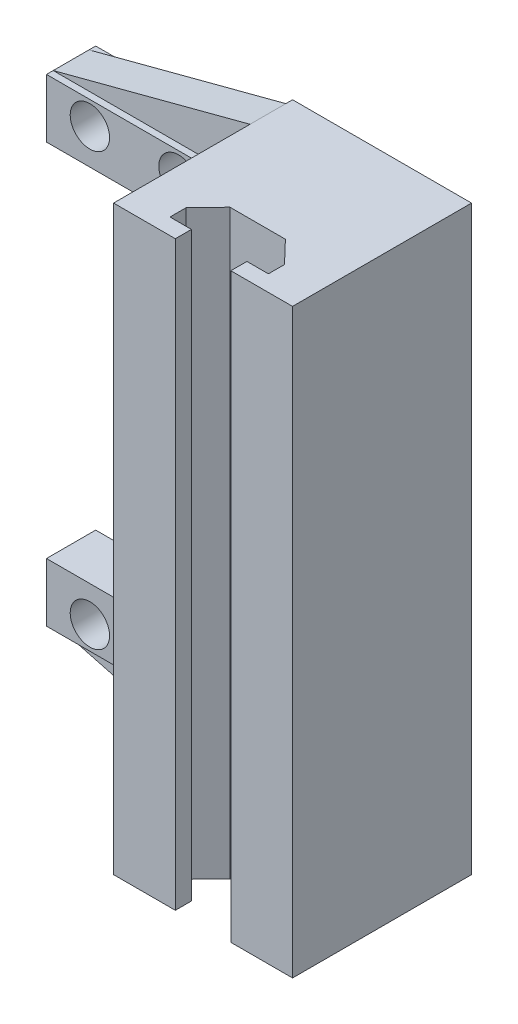
ISO-10303-21;
HEADER;
FILE_DESCRIPTION(('STEP AP214'),'2;1');
FILE_NAME('part.step','',(''),(''),'','','');
FILE_SCHEMA(('AUTOMOTIVE_DESIGN { 1 0 10303 214 1 1 1 1 }'));
ENDSEC;
DATA;
#1=APPLICATION_CONTEXT('core data for automotive mechanical design processes');
#2=APPLICATION_PROTOCOL_DEFINITION('international standard','automotive_design',2000,#1);
#3=PRODUCT_CONTEXT('',#1,'mechanical');
#4=PRODUCT('Part','Part','',(#3));
#5=PRODUCT_RELATED_PRODUCT_CATEGORY('part','',(#4));
#6=PRODUCT_DEFINITION_FORMATION('','',#4);
#7=PRODUCT_DEFINITION_CONTEXT('part definition',#1,'design');
#8=PRODUCT_DEFINITION('design','',#6,#7);
#9=PRODUCT_DEFINITION_SHAPE('','',#8);
#10=(LENGTH_UNIT() NAMED_UNIT(*) SI_UNIT(.MILLI.,.METRE.));
#11=(NAMED_UNIT(*) PLANE_ANGLE_UNIT() SI_UNIT($,.RADIAN.));
#12=(NAMED_UNIT(*) SI_UNIT($,.STERADIAN.) SOLID_ANGLE_UNIT());
#13=UNCERTAINTY_MEASURE_WITH_UNIT(LENGTH_MEASURE(1.E-05),#10,'distance_accuracy_value','');
#14=(GEOMETRIC_REPRESENTATION_CONTEXT(3) GLOBAL_UNCERTAINTY_ASSIGNED_CONTEXT((#13)) GLOBAL_UNIT_ASSIGNED_CONTEXT((#10,
#11,#12)) REPRESENTATION_CONTEXT('',''));
#15=CARTESIAN_POINT('',(0.,0.,0.));
#16=DIRECTION('',(0.,0.,1.));
#17=DIRECTION('',(1.,0.,0.));
#18=AXIS2_PLACEMENT_3D('',#15,#16,#17);
#19=CARTESIAN_POINT('',(-37.1897322756986,65.,21.1385668960311));
#20=DIRECTION('',(1.,0.,0.));
#21=DIRECTION('',(0.,0.,-1.));
#22=AXIS2_PLACEMENT_3D('',#19,#20,#21);
#23=PLANE('',#22);
#24=DIRECTION('',(0.,0.,1.));
#25=VECTOR('',#24,1.);
#26=CARTESIAN_POINT('',(-37.1897322756986,0.,21.1385668960311));
#27=LINE('',#26,#25);
#28=CARTESIAN_POINT('',(-37.1897322756986,0.,21.1385668960311));
#29=VERTEX_POINT('',#28);
#30=CARTESIAN_POINT('',(-37.1897322756986,0.,21.8885668960311));
#31=VERTEX_POINT('',#30);
#32=EDGE_CURVE('E276',#29,#31,#27,.T.);
#33=ORIENTED_EDGE('',*,*,#32,.T.);
#34=DIRECTION('',(0.,1.,0.));
#35=VECTOR('',#34,1.);
#36=CARTESIAN_POINT('',(-37.1897322756986,65.,21.8885668960311));
#37=LINE('',#36,#35);
#38=CARTESIAN_POINT('',(-37.1897322756986,5.8,21.8885668960311));
#39=VERTEX_POINT('',#38);
#40=EDGE_CURVE('E593',#31,#39,#37,.T.);
#41=ORIENTED_EDGE('',*,*,#40,.T.);
#42=DIRECTION('',(0.,0.,-1.));
#43=VECTOR('',#42,1.);
#44=CARTESIAN_POINT('',(-37.1897322756986,5.8,0.));
#45=LINE('',#44,#43);
#46=CARTESIAN_POINT('',(-37.1897322756986,5.8,21.1385668960311));
#47=VERTEX_POINT('',#46);
#48=EDGE_CURVE('E381',#39,#47,#45,.T.);
#49=ORIENTED_EDGE('',*,*,#48,.T.);
#50=DIRECTION('',(0.,-1.,0.));
#51=VECTOR('',#50,1.);
#52=CARTESIAN_POINT('',(-37.1897322756986,65.,21.1385668960311));
#53=LINE('',#52,#51);
#54=EDGE_CURVE('E61',#47,#29,#53,.T.);
#55=ORIENTED_EDGE('',*,*,#54,.T.);
#56=EDGE_LOOP('',(#33,#41,#49,#55));
#57=FACE_BOUND('',#56,.T.);
#58=ADVANCED_FACE('F49',(#57),#23,.F.);
#59=CARTESIAN_POINT('',(-57.1897322756986,5.8,0.));
#60=DIRECTION('',(0.,-1.,0.));
#61=DIRECTION('',(0.,0.,-1.));
#62=AXIS2_PLACEMENT_3D('',#59,#60,#61);
#63=PLANE('',#62);
#64=DIRECTION('',(0.,0.,1.));
#65=VECTOR('',#64,1.);
#66=CARTESIAN_POINT('',(-59.1897322756986,5.8,21.1385668960311));
#67=LINE('',#66,#65);
#68=CARTESIAN_POINT('',(-59.1897322756986,5.8,25.8885668960311));
#69=VERTEX_POINT('',#68);
#70=CARTESIAN_POINT('',(-59.1897322756986,5.8,26.6385668960311));
#71=VERTEX_POINT('',#70);
#72=EDGE_CURVE('E525',#69,#71,#67,.T.);
#73=ORIENTED_EDGE('',*,*,#72,.F.);
#74=DIRECTION('',(1.,0.,0.));
#75=VECTOR('',#74,1.);
#76=CARTESIAN_POINT('',(-57.1897322756986,5.8,25.8885668960311));
#77=LINE('',#76,#75);
#78=CARTESIAN_POINT('',(-37.1897322756986,5.8,25.8885668960311));
#79=VERTEX_POINT('',#78);
#80=EDGE_CURVE('E255',#69,#79,#77,.T.);
#81=ORIENTED_EDGE('',*,*,#80,.T.);
#82=CARTESIAN_POINT('',(-37.1897322756986,5.8,26.6385668960311));
#83=VERTEX_POINT('',#82);
#84=EDGE_CURVE('E267',#83,#79,#45,.T.);
#85=ORIENTED_EDGE('',*,*,#84,.F.);
#86=DIRECTION('',(1.,0.,0.));
#87=VECTOR('',#86,1.);
#88=CARTESIAN_POINT('',(-57.1897322756986,5.8,26.6385668960311));
#89=LINE('',#88,#87);
#90=EDGE_CURVE('E384',#71,#83,#89,.T.);
#91=ORIENTED_EDGE('',*,*,#90,.F.);
#92=EDGE_LOOP('',(#73,#81,#85,#91));
#93=FACE_BOUND('',#92,.T.);
#94=ADVANCED_FACE('F608',(#93),#63,.T.);
#95=CARTESIAN_POINT('',(-37.1897322756986,52.65,21.1385668960311));
#96=VERTEX_POINT('',#95);
#97=CARTESIAN_POINT('',(-37.1897322756986,12.35,21.1385668960311));
#98=VERTEX_POINT('',#97);
#99=EDGE_CURVE('E59',#96,#98,#53,.T.);
#100=ORIENTED_EDGE('',*,*,#99,.T.);
#101=DIRECTION('',(0.,0.,-1.));
#102=VECTOR('',#101,1.);
#103=CARTESIAN_POINT('',(-37.1897322756986,12.35,0.));
#104=LINE('',#103,#102);
#105=CARTESIAN_POINT('',(-37.1897322756986,12.35,26.6385668960311));
#106=VERTEX_POINT('',#105);
#107=EDGE_CURVE('E378',#106,#98,#104,.T.);
#108=ORIENTED_EDGE('',*,*,#107,.F.);
#109=DIRECTION('',(0.,1.,0.));
#110=VECTOR('',#109,1.);
#111=CARTESIAN_POINT('',(-37.1897322756986,0.,26.6385668960311));
#112=LINE('',#111,#110);
#113=EDGE_CURVE('E374',#83,#106,#112,.T.);
#114=ORIENTED_EDGE('',*,*,#113,.F.);
#115=ORIENTED_EDGE('',*,*,#84,.T.);
#116=DIRECTION('',(0.,1.,0.));
#117=VECTOR('',#116,1.);
#118=CARTESIAN_POINT('',(-37.1897322756986,65.,25.8885668960311));
#119=LINE('',#118,#117);
#120=CARTESIAN_POINT('',(-37.1897322756986,0.,25.8885668960311));
#121=VERTEX_POINT('',#120);
#122=EDGE_CURVE('E253',#121,#79,#119,.T.);
#123=ORIENTED_EDGE('',*,*,#122,.F.);
#124=CARTESIAN_POINT('',(-37.1897322756986,0.,41.1385668960311));
#125=VERTEX_POINT('',#124);
#126=EDGE_CURVE('E264',#121,#125,#27,.T.);
#127=ORIENTED_EDGE('',*,*,#126,.T.);
#128=DIRECTION('',(0.,-1.,0.));
#129=VECTOR('',#128,1.);
#130=CARTESIAN_POINT('',(-37.1897322756986,65.,41.1385668960311));
#131=LINE('',#130,#129);
#132=CARTESIAN_POINT('',(-37.1897322756986,65.,41.1385668960311));
#133=VERTEX_POINT('',#132);
#134=EDGE_CURVE('E285',#133,#125,#131,.T.);
#135=ORIENTED_EDGE('',*,*,#134,.F.);
#136=DIRECTION('',(0.,0.,1.));
#137=VECTOR('',#136,1.);
#138=CARTESIAN_POINT('',(-37.1897322756986,65.,21.1385668960311));
#139=LINE('',#138,#137);
#140=CARTESIAN_POINT('',(-37.1897322756986,65.,25.8885668960311));
#141=VERTEX_POINT('',#140);
#142=EDGE_CURVE('E446',#141,#133,#139,.T.);
#143=ORIENTED_EDGE('',*,*,#142,.F.);
#144=DIRECTION('',(0.,1.,0.));
#145=VECTOR('',#144,1.);
#146=CARTESIAN_POINT('',(-37.1897322756986,65.,25.8885668960311));
#147=LINE('',#146,#145);
#148=CARTESIAN_POINT('',(-37.1897322756986,59.2,25.8885668960311));
#149=VERTEX_POINT('',#148);
#150=EDGE_CURVE('E502',#149,#141,#147,.T.);
#151=ORIENTED_EDGE('',*,*,#150,.F.);
#152=DIRECTION('',(0.,0.,-1.));
#153=VECTOR('',#152,1.);
#154=CARTESIAN_POINT('',(-37.1897322756986,59.2,26.6385668960311));
#155=LINE('',#154,#153);
#156=CARTESIAN_POINT('',(-37.1897322756986,59.2,26.6385668960311));
#157=VERTEX_POINT('',#156);
#158=EDGE_CURVE('E367',#157,#149,#155,.T.);
#159=ORIENTED_EDGE('',*,*,#158,.F.);
#160=DIRECTION('',(0.,-1.,0.));
#161=VECTOR('',#160,1.);
#162=CARTESIAN_POINT('',(-37.1897322756986,59.2,26.6385668960311));
#163=LINE('',#162,#161);
#164=CARTESIAN_POINT('',(-37.1897322756986,52.65,26.6385668960311));
#165=VERTEX_POINT('',#164);
#166=EDGE_CURVE('E362',#157,#165,#163,.T.);
#167=ORIENTED_EDGE('',*,*,#166,.T.);
#168=DIRECTION('',(0.,0.,-1.));
#169=VECTOR('',#168,1.);
#170=CARTESIAN_POINT('',(-37.1897322756986,52.65,26.6385668960311));
#171=LINE('',#170,#169);
#172=EDGE_CURVE('E371',#165,#96,#171,.T.);
#173=ORIENTED_EDGE('',*,*,#172,.T.);
#174=EDGE_LOOP('',(#100,#108,#114,#115,#123,#127,#135,#143,#151,#159,#167,#173));
#175=FACE_BOUND('',#174,.T.);
#176=ADVANCED_FACE('F262',(#175),#23,.F.);
#177=CARTESIAN_POINT('',(-57.1897322756986,59.2,26.6385668960311));
#178=DIRECTION('',(0.,-1.,0.));
#179=DIRECTION('',(0.,0.,-1.));
#180=AXIS2_PLACEMENT_3D('',#177,#178,#179);
#181=PLANE('',#180);
#182=DIRECTION('',(1.,0.,0.));
#183=VECTOR('',#182,1.);
#184=CARTESIAN_POINT('',(-57.1897322756986,59.2,25.8885668960311));
#185=LINE('',#184,#183);
#186=CARTESIAN_POINT('',(-59.1897322756986,59.2,25.8885668960311));
#187=VERTEX_POINT('',#186);
#188=EDGE_CURVE('E620',#187,#149,#185,.T.);
#189=ORIENTED_EDGE('',*,*,#188,.F.);
#190=DIRECTION('',(0.,0.,-1.));
#191=VECTOR('',#190,1.);
#192=CARTESIAN_POINT('',(-59.1897322756986,59.2,21.1385668960311));
#193=LINE('',#192,#191);
#194=CARTESIAN_POINT('',(-59.1897322756986,59.2,26.6385668960311));
#195=VERTEX_POINT('',#194);
#196=EDGE_CURVE('E547',#195,#187,#193,.T.);
#197=ORIENTED_EDGE('',*,*,#196,.F.);
#198=DIRECTION('',(1.,0.,0.));
#199=VECTOR('',#198,1.);
#200=CARTESIAN_POINT('',(-57.1897322756986,59.2,26.6385668960311));
#201=LINE('',#200,#199);
#202=EDGE_CURVE('E349',#195,#157,#201,.T.);
#203=ORIENTED_EDGE('',*,*,#202,.T.);
#204=ORIENTED_EDGE('',*,*,#158,.T.);
#205=EDGE_LOOP('',(#189,#197,#203,#204));
#206=FACE_BOUND('',#205,.T.);
#207=ADVANCED_FACE('F633',(#206),#181,.F.);
#208=CARTESIAN_POINT('',(-37.1897322756986,65.,21.1385668960311));
#209=DIRECTION('',(0.,0.,-1.));
#210=DIRECTION('',(-1.,0.,0.));
#211=AXIS2_PLACEMENT_3D('',#208,#209,#210);
#212=PLANE('',#211);
#213=CARTESIAN_POINT('',(-44.4397322756986,56.6,21.1385668960311));
#214=DIRECTION('',(0.,0.,-1.));
#215=DIRECTION('',(-1.,0.,0.));
#216=AXIS2_PLACEMENT_3D('',#213,#214,#215);
#217=CIRCLE('',#216,2.2);
#218=CARTESIAN_POINT('',(-46.6397322756986,56.6,21.1385668960311));
#219=VERTEX_POINT('',#218);
#220=EDGE_CURVE('E557',#219,#219,#217,.T.);
#221=ORIENTED_EDGE('',*,*,#220,.F.);
#222=EDGE_LOOP('',(#221));
#223=FACE_BOUND('',#222,.T.);
#224=CARTESIAN_POINT('',(-54.3397322756986,8.4,21.1385668960311));
#225=DIRECTION('',(0.,0.,-1.));
#226=DIRECTION('',(-1.,0.,0.));
#227=AXIS2_PLACEMENT_3D('',#224,#225,#226);
#228=CIRCLE('',#227,2.2);
#229=CARTESIAN_POINT('',(-56.5397322756986,8.4,21.1385668960311));
#230=VERTEX_POINT('',#229);
#231=EDGE_CURVE('E556',#230,#230,#228,.T.);
#232=ORIENTED_EDGE('',*,*,#231,.F.);
#233=EDGE_LOOP('',(#232));
#234=FACE_BOUND('',#233,.T.);
#235=CARTESIAN_POINT('',(-44.4397322756986,8.4,21.1385668960311));
#236=DIRECTION('',(0.,0.,-1.));
#237=DIRECTION('',(-1.,0.,0.));
#238=AXIS2_PLACEMENT_3D('',#235,#236,#237);
#239=CIRCLE('',#238,2.2);
#240=CARTESIAN_POINT('',(-46.6397322756986,8.4,21.1385668960311));
#241=VERTEX_POINT('',#240);
#242=EDGE_CURVE('E551',#241,#241,#239,.T.);
#243=ORIENTED_EDGE('',*,*,#242,.F.);
#244=EDGE_LOOP('',(#243));
#245=FACE_BOUND('',#244,.T.);
#246=CARTESIAN_POINT('',(-54.3397322756986,56.6,21.1385668960311));
#247=DIRECTION('',(0.,0.,-1.));
#248=DIRECTION('',(-1.,0.,0.));
#249=AXIS2_PLACEMENT_3D('',#246,#247,#248);
#250=CIRCLE('',#249,2.2);
#251=CARTESIAN_POINT('',(-56.5397322756986,56.6,21.1385668960311));
#252=VERTEX_POINT('',#251);
#253=EDGE_CURVE('E334',#252,#252,#250,.T.);
#254=ORIENTED_EDGE('',*,*,#253,.F.);
#255=EDGE_LOOP('',(#254));
#256=FACE_BOUND('',#255,.T.);
#257=DIRECTION('',(1.,0.,0.));
#258=VECTOR('',#257,1.);
#259=CARTESIAN_POINT('',(-37.1897322756986,0.,21.1385668960311));
#260=LINE('',#259,#258);
#261=CARTESIAN_POINT('',(-17.1897322756986,0.,21.1385668960311));
#262=VERTEX_POINT('',#261);
#263=EDGE_CURVE('E400',#29,#262,#260,.T.);
#264=ORIENTED_EDGE('',*,*,#263,.F.);
#265=ORIENTED_EDGE('',*,*,#54,.F.);
#266=DIRECTION('',(1.,0.,0.));
#267=VECTOR('',#266,1.);
#268=CARTESIAN_POINT('',(-57.1897322756986,5.8,21.1385668960311));
#269=LINE('',#268,#267);
#270=CARTESIAN_POINT('',(-59.1897322756986,5.8,21.1385668960311));
#271=VERTEX_POINT('',#270);
#272=EDGE_CURVE('E388',#271,#47,#269,.T.);
#273=ORIENTED_EDGE('',*,*,#272,.F.);
#274=DIRECTION('',(0.,-1.,0.));
#275=VECTOR('',#274,1.);
#276=CARTESIAN_POINT('',(-59.1897322756986,5.8,21.1385668960311));
#277=LINE('',#276,#275);
#278=CARTESIAN_POINT('',(-59.1897322756986,12.35,21.1385668960311));
#279=VERTEX_POINT('',#278);
#280=EDGE_CURVE('E530',#279,#271,#277,.T.);
#281=ORIENTED_EDGE('',*,*,#280,.F.);
#282=DIRECTION('',(1.,0.,0.));
#283=VECTOR('',#282,1.);
#284=CARTESIAN_POINT('',(-57.1897322756986,12.35,21.1385668960311));
#285=LINE('',#284,#283);
#286=EDGE_CURVE('E392',#279,#98,#285,.T.);
#287=ORIENTED_EDGE('',*,*,#286,.T.);
#288=ORIENTED_EDGE('',*,*,#99,.F.);
#289=DIRECTION('',(1.,0.,0.));
#290=VECTOR('',#289,1.);
#291=CARTESIAN_POINT('',(-57.1897322756986,52.65,21.1385668960311));
#292=LINE('',#291,#290);
#293=CARTESIAN_POINT('',(-59.1897322756986,52.65,21.1385668960311));
#294=VERTEX_POINT('',#293);
#295=EDGE_CURVE('E366',#294,#96,#292,.T.);
#296=ORIENTED_EDGE('',*,*,#295,.F.);
#297=DIRECTION('',(0.,-1.,0.));
#298=VECTOR('',#297,1.);
#299=CARTESIAN_POINT('',(-59.1897322756986,59.2,21.1385668960311));
#300=LINE('',#299,#298);
#301=CARTESIAN_POINT('',(-59.1897322756986,59.2,21.1385668960311));
#302=VERTEX_POINT('',#301);
#303=EDGE_CURVE('E535',#302,#294,#300,.T.);
#304=ORIENTED_EDGE('',*,*,#303,.F.);
#305=DIRECTION('',(1.,0.,0.));
#306=VECTOR('',#305,1.);
#307=CARTESIAN_POINT('',(-57.1897322756986,59.2,21.1385668960311));
#308=LINE('',#307,#306);
#309=CARTESIAN_POINT('',(-37.1897322756986,59.2,21.1385668960311));
#310=VERTEX_POINT('',#309);
#311=EDGE_CURVE('E358',#302,#310,#308,.T.);
#312=ORIENTED_EDGE('',*,*,#311,.T.);
#313=CARTESIAN_POINT('',(-37.1897322756986,65.,21.1385668960311));
#314=VERTEX_POINT('',#313);
#315=EDGE_CURVE('E11',#314,#310,#53,.T.);
#316=ORIENTED_EDGE('',*,*,#315,.F.);
#317=DIRECTION('',(1.,0.,0.));
#318=VECTOR('',#317,1.);
#319=CARTESIAN_POINT('',(-37.1897322756986,65.,21.1385668960311));
#320=LINE('',#319,#318);
#321=CARTESIAN_POINT('',(-17.1897322756986,65.,21.1385668960311));
#322=VERTEX_POINT('',#321);
#323=EDGE_CURVE('E280',#314,#322,#320,.T.);
#324=ORIENTED_EDGE('',*,*,#323,.T.);
#325=DIRECTION('',(0.,-1.,0.));
#326=VECTOR('',#325,1.);
#327=CARTESIAN_POINT('',(-17.1897322756986,65.,21.1385668960311));
#328=LINE('',#327,#326);
#329=EDGE_CURVE('E325',#322,#262,#328,.T.);
#330=ORIENTED_EDGE('',*,*,#329,.T.);
#331=EDGE_LOOP('',(#264,#265,#273,#281,#287,#288,#296,#304,#312,#316,#324,#330));
#332=FACE_BOUND('',#331,.T.);
#333=ADVANCED_FACE('F51',(#223,#234,#245,#256,#332),#212,.T.);
#334=CARTESIAN_POINT('',(-37.1897322756986,59.2,21.8885668960311));
#335=VERTEX_POINT('',#334);
#336=EDGE_CURVE('E365',#335,#310,#155,.T.);
#337=ORIENTED_EDGE('',*,*,#336,.F.);
#338=DIRECTION('',(0.,1.,0.));
#339=VECTOR('',#338,1.);
#340=CARTESIAN_POINT('',(-37.1897322756986,65.,21.8885668960311));
#341=LINE('',#340,#339);
#342=CARTESIAN_POINT('',(-37.1897322756986,65.,21.8885668960311));
#343=VERTEX_POINT('',#342);
#344=EDGE_CURVE('E518',#335,#343,#341,.T.);
#345=ORIENTED_EDGE('',*,*,#344,.T.);
#346=EDGE_CURVE('E328',#314,#343,#139,.T.);
#347=ORIENTED_EDGE('',*,*,#346,.F.);
#348=ORIENTED_EDGE('',*,*,#315,.T.);
#349=EDGE_LOOP('',(#337,#345,#347,#348));
#350=FACE_BOUND('',#349,.T.);
#351=ADVANCED_FACE('F583',(#350),#23,.F.);
#352=CARTESIAN_POINT('',(-37.1897322756986,65.,41.1385668960311));
#353=DIRECTION('',(0.,0.,-1.));
#354=DIRECTION('',(-1.,0.,0.));
#355=AXIS2_PLACEMENT_3D('',#352,#353,#354);
#356=PLANE('',#355);
#357=DIRECTION('',(1.,0.,0.));
#358=VECTOR('',#357,1.);
#359=CARTESIAN_POINT('',(-37.1897322756986,0.,41.1385668960311));
#360=LINE('',#359,#358);
#361=CARTESIAN_POINT('',(-30.2897322756986,0.,41.1385668960311));
#362=VERTEX_POINT('',#361);
#363=EDGE_CURVE('E274',#125,#362,#360,.T.);
#364=ORIENTED_EDGE('',*,*,#363,.T.);
#365=DIRECTION('',(0.,-1.,0.));
#366=VECTOR('',#365,1.);
#367=CARTESIAN_POINT('',(-30.2897322756986,65.,41.1385668960311));
#368=LINE('',#367,#366);
#369=CARTESIAN_POINT('',(-30.2897322756986,65.,41.1385668960311));
#370=VERTEX_POINT('',#369);
#371=EDGE_CURVE('E288',#370,#362,#368,.T.);
#372=ORIENTED_EDGE('',*,*,#371,.F.);
#373=DIRECTION('',(1.,0.,0.));
#374=VECTOR('',#373,1.);
#375=CARTESIAN_POINT('',(-37.1897322756986,65.,41.1385668960311));
#376=LINE('',#375,#374);
#377=EDGE_CURVE('E443',#133,#370,#376,.T.);
#378=ORIENTED_EDGE('',*,*,#377,.F.);
#379=ORIENTED_EDGE('',*,*,#134,.T.);
#380=EDGE_LOOP('',(#364,#372,#378,#379));
#381=FACE_BOUND('',#380,.T.);
#382=ADVANCED_FACE('F498',(#381),#356,.F.);
#383=CARTESIAN_POINT('',(-30.2897322756986,65.,39.3385668960311));
#384=DIRECTION('',(1.,0.,0.));
#385=DIRECTION('',(0.,0.,-1.));
#386=AXIS2_PLACEMENT_3D('',#383,#384,#385);
#387=PLANE('',#386);
#388=DIRECTION('',(0.,0.,1.));
#389=VECTOR('',#388,1.);
#390=CARTESIAN_POINT('',(-30.2897322756986,0.,39.3385668960311));
#391=LINE('',#390,#389);
#392=CARTESIAN_POINT('',(-30.2897322756986,0.,39.3385668960311));
#393=VERTEX_POINT('',#392);
#394=EDGE_CURVE('E281',#393,#362,#391,.T.);
#395=ORIENTED_EDGE('',*,*,#394,.F.);
#396=DIRECTION('',(0.,-1.,0.));
#397=VECTOR('',#396,1.);
#398=CARTESIAN_POINT('',(-30.2897322756986,65.,39.3385668960311));
#399=LINE('',#398,#397);
#400=CARTESIAN_POINT('',(-30.2897322756986,65.,39.3385668960311));
#401=VERTEX_POINT('',#400);
#402=EDGE_CURVE('E291',#401,#393,#399,.T.);
#403=ORIENTED_EDGE('',*,*,#402,.F.);
#404=DIRECTION('',(0.,0.,1.));
#405=VECTOR('',#404,1.);
#406=CARTESIAN_POINT('',(-30.2897322756986,65.,39.3385668960311));
#407=LINE('',#406,#405);
#408=EDGE_CURVE('E439',#401,#370,#407,.T.);
#409=ORIENTED_EDGE('',*,*,#408,.T.);
#410=ORIENTED_EDGE('',*,*,#371,.T.);
#411=EDGE_LOOP('',(#395,#403,#409,#410));
#412=FACE_BOUND('',#411,.T.);
#413=ADVANCED_FACE('F493',(#412),#387,.T.);
#414=CARTESIAN_POINT('',(-32.6897322756986,65.,39.3385668960311));
#415=DIRECTION('',(0.,0.,-1.));
#416=DIRECTION('',(-1.,0.,0.));
#417=AXIS2_PLACEMENT_3D('',#414,#415,#416);
#418=PLANE('',#417);
#419=DIRECTION('',(1.,0.,0.));
#420=VECTOR('',#419,1.);
#421=CARTESIAN_POINT('',(-32.6897322756986,0.,39.3385668960311));
#422=LINE('',#421,#420);
#423=CARTESIAN_POINT('',(-32.6897322756986,0.,39.3385668960311));
#424=VERTEX_POINT('',#423);
#425=EDGE_CURVE('E485',#424,#393,#422,.T.);
#426=ORIENTED_EDGE('',*,*,#425,.F.);
#427=DIRECTION('',(0.,-1.,0.));
#428=VECTOR('',#427,1.);
#429=CARTESIAN_POINT('',(-32.6897322756986,65.,39.3385668960311));
#430=LINE('',#429,#428);
#431=CARTESIAN_POINT('',(-32.6897322756986,65.,39.3385668960311));
#432=VERTEX_POINT('',#431);
#433=EDGE_CURVE('E294',#432,#424,#430,.T.);
#434=ORIENTED_EDGE('',*,*,#433,.F.);
#435=DIRECTION('',(1.,0.,0.));
#436=VECTOR('',#435,1.);
#437=CARTESIAN_POINT('',(-32.6897322756986,65.,39.3385668960311));
#438=LINE('',#437,#436);
#439=EDGE_CURVE('E435',#432,#401,#438,.T.);
#440=ORIENTED_EDGE('',*,*,#439,.T.);
#441=ORIENTED_EDGE('',*,*,#402,.T.);
#442=EDGE_LOOP('',(#426,#434,#440,#441));
#443=FACE_BOUND('',#442,.T.);
#444=ADVANCED_FACE('F1008',(#443),#418,.T.);
#445=CARTESIAN_POINT('',(-32.6897322756986,65.,39.3385668960311));
#446=DIRECTION('',(-1.,0.,0.));
#447=DIRECTION('',(0.,0.,1.));
#448=AXIS2_PLACEMENT_3D('',#445,#446,#447);
#449=PLANE('',#448);
#450=DIRECTION('',(0.,0.,-1.));
#451=VECTOR('',#450,1.);
#452=CARTESIAN_POINT('',(-32.6897322756986,0.,39.3385668960311));
#453=LINE('',#452,#451);
#454=CARTESIAN_POINT('',(-32.6897322756986,0.,37.5385668960311));
#455=VERTEX_POINT('',#454);
#456=EDGE_CURVE('E482',#424,#455,#453,.T.);
#457=ORIENTED_EDGE('',*,*,#456,.T.);
#458=DIRECTION('',(0.,-1.,0.));
#459=VECTOR('',#458,1.);
#460=CARTESIAN_POINT('',(-32.6897322756986,65.,37.5385668960311));
#461=LINE('',#460,#459);
#462=CARTESIAN_POINT('',(-32.6897322756986,65.,37.5385668960311));
#463=VERTEX_POINT('',#462);
#464=EDGE_CURVE('E297',#463,#455,#461,.T.);
#465=ORIENTED_EDGE('',*,*,#464,.F.);
#466=DIRECTION('',(0.,0.,-1.));
#467=VECTOR('',#466,1.);
#468=CARTESIAN_POINT('',(-32.6897322756986,65.,39.3385668960311));
#469=LINE('',#468,#467);
#470=EDGE_CURVE('E432',#432,#463,#469,.T.);
#471=ORIENTED_EDGE('',*,*,#470,.F.);
#472=ORIENTED_EDGE('',*,*,#433,.T.);
#473=EDGE_LOOP('',(#457,#465,#471,#472));
#474=FACE_BOUND('',#473,.T.);
#475=ADVANCED_FACE('F998',(#474),#449,.F.);
#476=CARTESIAN_POINT('',(-32.6897322756986,65.,37.5385668960311));
#477=DIRECTION('',(-0.721387321030951,0.,-0.692531828189713));
#478=DIRECTION('',(-0.692531828189713,0.,0.721387321030951));
#479=AXIS2_PLACEMENT_3D('',#476,#477,#478);
#480=PLANE('',#479);
#481=DIRECTION('',(0.692531828189713,0.,-0.721387321030951));
#482=VECTOR('',#481,1.);
#483=CARTESIAN_POINT('',(-32.6897322756986,0.,37.5385668960311));
#484=LINE('',#483,#482);
#485=CARTESIAN_POINT('',(-30.2897322756986,0.,35.0385668960311));
#486=VERTEX_POINT('',#485);
#487=EDGE_CURVE('E479',#455,#486,#484,.T.);
#488=ORIENTED_EDGE('',*,*,#487,.T.);
#489=DIRECTION('',(0.,-1.,0.));
#490=VECTOR('',#489,1.);
#491=CARTESIAN_POINT('',(-30.2897322756986,65.,35.0385668960311));
#492=LINE('',#491,#490);
#493=CARTESIAN_POINT('',(-30.2897322756986,65.,35.0385668960311));
#494=VERTEX_POINT('',#493);
#495=EDGE_CURVE('E301',#494,#486,#492,.T.);
#496=ORIENTED_EDGE('',*,*,#495,.F.);
#497=DIRECTION('',(0.692531828189713,0.,-0.721387321030951));
#498=VECTOR('',#497,1.);
#499=CARTESIAN_POINT('',(-32.6897322756986,65.,37.5385668960311));
#500=LINE('',#499,#498);
#501=EDGE_CURVE('E429',#463,#494,#500,.T.);
#502=ORIENTED_EDGE('',*,*,#501,.F.);
#503=ORIENTED_EDGE('',*,*,#464,.T.);
#504=EDGE_LOOP('',(#488,#496,#502,#503));
#505=FACE_BOUND('',#504,.T.);
#506=ADVANCED_FACE('F988',(#505),#480,.F.);
#507=CARTESIAN_POINT('',(-30.2897322756986,65.,35.0385668960311));
#508=DIRECTION('',(0.,0.,-1.));
#509=DIRECTION('',(-1.,0.,0.));
#510=AXIS2_PLACEMENT_3D('',#507,#508,#509);
#511=PLANE('',#510);
#512=DIRECTION('',(1.,0.,0.));
#513=VECTOR('',#512,1.);
#514=CARTESIAN_POINT('',(-30.2897322756986,0.,35.0385668960311));
#515=LINE('',#514,#513);
#516=CARTESIAN_POINT('',(-24.0897322756986,0.,35.0385668960311));
#517=VERTEX_POINT('',#516);
#518=EDGE_CURVE('E475',#486,#517,#515,.T.);
#519=ORIENTED_EDGE('',*,*,#518,.T.);
#520=DIRECTION('',(0.,-1.,0.));
#521=VECTOR('',#520,1.);
#522=CARTESIAN_POINT('',(-24.0897322756986,65.,35.0385668960311));
#523=LINE('',#522,#521);
#524=CARTESIAN_POINT('',(-24.0897322756986,65.,35.0385668960311));
#525=VERTEX_POINT('',#524);
#526=EDGE_CURVE('E305',#525,#517,#523,.T.);
#527=ORIENTED_EDGE('',*,*,#526,.F.);
#528=DIRECTION('',(1.,0.,0.));
#529=VECTOR('',#528,1.);
#530=CARTESIAN_POINT('',(-30.2897322756986,65.,35.0385668960311));
#531=LINE('',#530,#529);
#532=EDGE_CURVE('E426',#494,#525,#531,.T.);
#533=ORIENTED_EDGE('',*,*,#532,.F.);
#534=ORIENTED_EDGE('',*,*,#495,.T.);
#535=EDGE_LOOP('',(#519,#527,#533,#534));
#536=FACE_BOUND('',#535,.T.);
#537=ADVANCED_FACE('F978',(#536),#511,.F.);
#538=CARTESIAN_POINT('',(-21.6897322756986,65.,37.5385668960311));
#539=DIRECTION('',(-0.72138732103095,0.,0.692531828189715));
#540=DIRECTION('',(0.692531828189715,0.,0.72138732103095));
#541=AXIS2_PLACEMENT_3D('',#538,#539,#540);
#542=PLANE('',#541);
#543=DIRECTION('',(-0.692531828189715,0.,-0.721387321030951));
#544=VECTOR('',#543,1.);
#545=CARTESIAN_POINT('',(-21.6897322756986,0.,37.5385668960311));
#546=LINE('',#545,#544);
#547=CARTESIAN_POINT('',(-21.6897322756986,0.,37.5385668960311));
#548=VERTEX_POINT('',#547);
#549=EDGE_CURVE('E471',#548,#517,#546,.T.);
#550=ORIENTED_EDGE('',*,*,#549,.F.);
#551=DIRECTION('',(0.,-1.,0.));
#552=VECTOR('',#551,1.);
#553=CARTESIAN_POINT('',(-21.6897322756986,65.,37.5385668960311));
#554=LINE('',#553,#552);
#555=CARTESIAN_POINT('',(-21.6897322756986,65.,37.5385668960311));
#556=VERTEX_POINT('',#555);
#557=EDGE_CURVE('E308',#556,#548,#554,.T.);
#558=ORIENTED_EDGE('',*,*,#557,.F.);
#559=DIRECTION('',(-0.692531828189715,0.,-0.721387321030951));
#560=VECTOR('',#559,1.);
#561=CARTESIAN_POINT('',(-21.6897322756986,65.,37.5385668960311));
#562=LINE('',#561,#560);
#563=EDGE_CURVE('E422',#556,#525,#562,.T.);
#564=ORIENTED_EDGE('',*,*,#563,.T.);
#565=ORIENTED_EDGE('',*,*,#526,.T.);
#566=EDGE_LOOP('',(#550,#558,#564,#565));
#567=FACE_BOUND('',#566,.T.);
#568=ADVANCED_FACE('F968',(#567),#542,.T.);
#569=CARTESIAN_POINT('',(-21.6897322756986,65.,39.3385668960311));
#570=DIRECTION('',(-1.,0.,0.));
#571=DIRECTION('',(0.,0.,1.));
#572=AXIS2_PLACEMENT_3D('',#569,#570,#571);
#573=PLANE('',#572);
#574=DIRECTION('',(0.,0.,-1.));
#575=VECTOR('',#574,1.);
#576=CARTESIAN_POINT('',(-21.6897322756986,0.,39.3385668960311));
#577=LINE('',#576,#575);
#578=CARTESIAN_POINT('',(-21.6897322756986,0.,39.3385668960311));
#579=VERTEX_POINT('',#578);
#580=EDGE_CURVE('E467',#579,#548,#577,.T.);
#581=ORIENTED_EDGE('',*,*,#580,.F.);
#582=DIRECTION('',(0.,-1.,0.));
#583=VECTOR('',#582,1.);
#584=CARTESIAN_POINT('',(-21.6897322756986,65.,39.3385668960311));
#585=LINE('',#584,#583);
#586=CARTESIAN_POINT('',(-21.6897322756986,65.,39.3385668960311));
#587=VERTEX_POINT('',#586);
#588=EDGE_CURVE('E311',#587,#579,#585,.T.);
#589=ORIENTED_EDGE('',*,*,#588,.F.);
#590=DIRECTION('',(0.,0.,-1.));
#591=VECTOR('',#590,1.);
#592=CARTESIAN_POINT('',(-21.6897322756986,65.,39.3385668960311));
#593=LINE('',#592,#591);
#594=EDGE_CURVE('E418',#587,#556,#593,.T.);
#595=ORIENTED_EDGE('',*,*,#594,.T.);
#596=ORIENTED_EDGE('',*,*,#557,.T.);
#597=EDGE_LOOP('',(#581,#589,#595,#596));
#598=FACE_BOUND('',#597,.T.);
#599=ADVANCED_FACE('F958',(#598),#573,.T.);
#600=CARTESIAN_POINT('',(-24.0897322756986,65.,39.3385668960311));
#601=DIRECTION('',(0.,0.,-1.));
#602=DIRECTION('',(-1.,0.,0.));
#603=AXIS2_PLACEMENT_3D('',#600,#601,#602);
#604=PLANE('',#603);
#605=DIRECTION('',(1.,0.,0.));
#606=VECTOR('',#605,1.);
#607=CARTESIAN_POINT('',(-24.0897322756986,0.,39.3385668960311));
#608=LINE('',#607,#606);
#609=CARTESIAN_POINT('',(-24.0897322756986,0.,39.3385668960311));
#610=VERTEX_POINT('',#609);
#611=EDGE_CURVE('E463',#610,#579,#608,.T.);
#612=ORIENTED_EDGE('',*,*,#611,.F.);
#613=DIRECTION('',(0.,-1.,0.));
#614=VECTOR('',#613,1.);
#615=CARTESIAN_POINT('',(-24.0897322756986,65.,39.3385668960311));
#616=LINE('',#615,#614);
#617=CARTESIAN_POINT('',(-24.0897322756986,65.,39.3385668960311));
#618=VERTEX_POINT('',#617);
#619=EDGE_CURVE('E314',#618,#610,#616,.T.);
#620=ORIENTED_EDGE('',*,*,#619,.F.);
#621=DIRECTION('',(1.,0.,0.));
#622=VECTOR('',#621,1.);
#623=CARTESIAN_POINT('',(-24.0897322756986,65.,39.3385668960311));
#624=LINE('',#623,#622);
#625=EDGE_CURVE('E414',#618,#587,#624,.T.);
#626=ORIENTED_EDGE('',*,*,#625,.T.);
#627=ORIENTED_EDGE('',*,*,#588,.T.);
#628=EDGE_LOOP('',(#612,#620,#626,#627));
#629=FACE_BOUND('',#628,.T.);
#630=ADVANCED_FACE('F948',(#629),#604,.T.);
#631=CARTESIAN_POINT('',(-24.0897322756986,65.,39.3385668960311));
#632=DIRECTION('',(1.,0.,0.));
#633=DIRECTION('',(0.,0.,-1.));
#634=AXIS2_PLACEMENT_3D('',#631,#632,#633);
#635=PLANE('',#634);
#636=DIRECTION('',(0.,0.,1.));
#637=VECTOR('',#636,1.);
#638=CARTESIAN_POINT('',(-24.0897322756986,0.,39.3385668960311));
#639=LINE('',#638,#637);
#640=CARTESIAN_POINT('',(-24.0897322756986,0.,41.1385668960311));
#641=VERTEX_POINT('',#640);
#642=EDGE_CURVE('E460',#610,#641,#639,.T.);
#643=ORIENTED_EDGE('',*,*,#642,.T.);
#644=DIRECTION('',(0.,-1.,0.));
#645=VECTOR('',#644,1.);
#646=CARTESIAN_POINT('',(-24.0897322756986,65.,41.1385668960311));
#647=LINE('',#646,#645);
#648=CARTESIAN_POINT('',(-24.0897322756986,65.,41.1385668960311));
#649=VERTEX_POINT('',#648);
#650=EDGE_CURVE('E317',#649,#641,#647,.T.);
#651=ORIENTED_EDGE('',*,*,#650,.F.);
#652=DIRECTION('',(0.,0.,1.));
#653=VECTOR('',#652,1.);
#654=CARTESIAN_POINT('',(-24.0897322756986,65.,39.3385668960311));
#655=LINE('',#654,#653);
#656=EDGE_CURVE('E411',#618,#649,#655,.T.);
#657=ORIENTED_EDGE('',*,*,#656,.F.);
#658=ORIENTED_EDGE('',*,*,#619,.T.);
#659=EDGE_LOOP('',(#643,#651,#657,#658));
#660=FACE_BOUND('',#659,.T.);
#661=ADVANCED_FACE('F938',(#660),#635,.F.);
#662=CARTESIAN_POINT('',(-24.0897322756986,65.,41.1385668960311));
#663=DIRECTION('',(0.,0.,-1.));
#664=DIRECTION('',(-1.,0.,0.));
#665=AXIS2_PLACEMENT_3D('',#662,#663,#664);
#666=PLANE('',#665);
#667=DIRECTION('',(1.,0.,0.));
#668=VECTOR('',#667,1.);
#669=CARTESIAN_POINT('',(-24.0897322756986,0.,41.1385668960311));
#670=LINE('',#669,#668);
#671=CARTESIAN_POINT('',(-17.1897322756986,0.,41.1385668960311));
#672=VERTEX_POINT('',#671);
#673=EDGE_CURVE('E456',#641,#672,#670,.T.);
#674=ORIENTED_EDGE('',*,*,#673,.T.);
#675=DIRECTION('',(0.,-1.,0.));
#676=VECTOR('',#675,1.);
#677=CARTESIAN_POINT('',(-17.1897322756986,65.,41.1385668960311));
#678=LINE('',#677,#676);
#679=CARTESIAN_POINT('',(-17.1897322756986,65.,41.1385668960311));
#680=VERTEX_POINT('',#679);
#681=EDGE_CURVE('E321',#680,#672,#678,.T.);
#682=ORIENTED_EDGE('',*,*,#681,.F.);
#683=DIRECTION('',(1.,0.,0.));
#684=VECTOR('',#683,1.);
#685=CARTESIAN_POINT('',(-24.0897322756986,65.,41.1385668960311));
#686=LINE('',#685,#684);
#687=EDGE_CURVE('E407',#649,#680,#686,.T.);
#688=ORIENTED_EDGE('',*,*,#687,.F.);
#689=ORIENTED_EDGE('',*,*,#650,.T.);
#690=EDGE_LOOP('',(#674,#682,#688,#689));
#691=FACE_BOUND('',#690,.T.);
#692=ADVANCED_FACE('F931',(#691),#666,.F.);
#693=CARTESIAN_POINT('',(-17.1897322756986,65.,21.1385668960311));
#694=DIRECTION('',(1.,0.,0.));
#695=DIRECTION('',(0.,0.,-1.));
#696=AXIS2_PLACEMENT_3D('',#693,#694,#695);
#697=PLANE('',#696);
#698=DIRECTION('',(0.,0.,1.));
#699=VECTOR('',#698,1.);
#700=CARTESIAN_POINT('',(-17.1897322756986,65.,21.1385668960311));
#701=LINE('',#700,#699);
#702=EDGE_CURVE('E404',#322,#680,#701,.T.);
#703=ORIENTED_EDGE('',*,*,#702,.T.);
#704=ORIENTED_EDGE('',*,*,#681,.T.);
#705=DIRECTION('',(0.,0.,1.));
#706=VECTOR('',#705,1.);
#707=CARTESIAN_POINT('',(-17.1897322756986,0.,21.1385668960311));
#708=LINE('',#707,#706);
#709=EDGE_CURVE('E453',#262,#672,#708,.T.);
#710=ORIENTED_EDGE('',*,*,#709,.F.);
#711=ORIENTED_EDGE('',*,*,#329,.F.);
#712=EDGE_LOOP('',(#703,#704,#710,#711));
#713=FACE_BOUND('',#712,.T.);
#714=ADVANCED_FACE('F588',(#713),#697,.T.);
#715=CARTESIAN_POINT('',(0.,65.,0.));
#716=DIRECTION('',(0.,-1.,0.));
#717=DIRECTION('',(0.,0.,-1.));
#718=AXIS2_PLACEMENT_3D('',#715,#716,#717);
#719=PLANE('',#718);
#720=ORIENTED_EDGE('',*,*,#346,.T.);
#721=DIRECTION('',(0.,0.,-1.));
#722=VECTOR('',#721,1.);
#723=CARTESIAN_POINT('',(-37.1897322756986,65.,0.));
#724=LINE('',#723,#722);
#725=EDGE_CURVE('E505',#141,#343,#724,.T.);
#726=ORIENTED_EDGE('',*,*,#725,.F.);
#727=ORIENTED_EDGE('',*,*,#142,.T.);
#728=ORIENTED_EDGE('',*,*,#377,.T.);
#729=ORIENTED_EDGE('',*,*,#408,.F.);
#730=ORIENTED_EDGE('',*,*,#439,.F.);
#731=ORIENTED_EDGE('',*,*,#470,.T.);
#732=ORIENTED_EDGE('',*,*,#501,.T.);
#733=ORIENTED_EDGE('',*,*,#532,.T.);
#734=ORIENTED_EDGE('',*,*,#563,.F.);
#735=ORIENTED_EDGE('',*,*,#594,.F.);
#736=ORIENTED_EDGE('',*,*,#625,.F.);
#737=ORIENTED_EDGE('',*,*,#656,.T.);
#738=ORIENTED_EDGE('',*,*,#687,.T.);
#739=ORIENTED_EDGE('',*,*,#702,.F.);
#740=ORIENTED_EDGE('',*,*,#323,.F.);
#741=EDGE_LOOP('',(#720,#726,#727,#728,#729,#730,#731,#732,#733,#734,#735,#736,#737,#738,#739,#740));
#742=FACE_BOUND('',#741,.T.);
#743=ADVANCED_FACE('F506',(#742),#719,.F.);
#744=CARTESIAN_POINT('',(0.,0.,0.));
#745=DIRECTION('',(0.,-1.,0.));
#746=DIRECTION('',(0.,0.,-1.));
#747=AXIS2_PLACEMENT_3D('',#744,#745,#746);
#748=PLANE('',#747);
#749=ORIENTED_EDGE('',*,*,#709,.T.);
#750=ORIENTED_EDGE('',*,*,#673,.F.);
#751=ORIENTED_EDGE('',*,*,#642,.F.);
#752=ORIENTED_EDGE('',*,*,#611,.T.);
#753=ORIENTED_EDGE('',*,*,#580,.T.);
#754=ORIENTED_EDGE('',*,*,#549,.T.);
#755=ORIENTED_EDGE('',*,*,#518,.F.);
#756=ORIENTED_EDGE('',*,*,#487,.F.);
#757=ORIENTED_EDGE('',*,*,#456,.F.);
#758=ORIENTED_EDGE('',*,*,#425,.T.);
#759=ORIENTED_EDGE('',*,*,#394,.T.);
#760=ORIENTED_EDGE('',*,*,#363,.F.);
#761=ORIENTED_EDGE('',*,*,#126,.F.);
#762=DIRECTION('',(0.,0.,1.));
#763=VECTOR('',#762,1.);
#764=CARTESIAN_POINT('',(-37.1897322756986,0.,0.));
#765=LINE('',#764,#763);
#766=EDGE_CURVE('E238',#121,#31,#765,.F.);
#767=ORIENTED_EDGE('',*,*,#766,.T.);
#768=ORIENTED_EDGE('',*,*,#32,.F.);
#769=ORIENTED_EDGE('',*,*,#263,.T.);
#770=EDGE_LOOP('',(#749,#750,#751,#752,#753,#754,#755,#756,#757,#758,#759,#760,#761,#767,#768,#769));
#771=FACE_BOUND('',#770,.T.);
#772=ADVANCED_FACE('F271',(#771),#748,.T.);
#773=CARTESIAN_POINT('',(-57.1897322756986,0.,26.6385668960311));
#774=DIRECTION('',(0.,0.,-1.));
#775=DIRECTION('',(-1.,0.,0.));
#776=AXIS2_PLACEMENT_3D('',#773,#774,#775);
#777=PLANE('',#776);
#778=CARTESIAN_POINT('',(-54.3397322756986,8.4,26.6385668960311));
#779=DIRECTION('',(0.,0.,-1.));
#780=DIRECTION('',(-1.,0.,0.));
#781=AXIS2_PLACEMENT_3D('',#778,#779,#780);
#782=CIRCLE('',#781,2.2);
#783=CARTESIAN_POINT('',(-56.5397322756986,8.4,26.6385668960311));
#784=VERTEX_POINT('',#783);
#785=EDGE_CURVE('E53',#784,#784,#782,.T.);
#786=ORIENTED_EDGE('',*,*,#785,.T.);
#787=EDGE_LOOP('',(#786));
#788=FACE_BOUND('',#787,.T.);
#789=CARTESIAN_POINT('',(-44.4397322756986,8.4,26.6385668960311));
#790=DIRECTION('',(0.,0.,-1.));
#791=DIRECTION('',(-1.,0.,0.));
#792=AXIS2_PLACEMENT_3D('',#789,#790,#791);
#793=CIRCLE('',#792,2.2);
#794=CARTESIAN_POINT('',(-46.6397322756986,8.4,26.6385668960311));
#795=VERTEX_POINT('',#794);
#796=EDGE_CURVE('E337',#795,#795,#793,.T.);
#797=ORIENTED_EDGE('',*,*,#796,.T.);
#798=EDGE_LOOP('',(#797));
#799=FACE_BOUND('',#798,.T.);
#800=ORIENTED_EDGE('',*,*,#113,.T.);
#801=DIRECTION('',(1.,0.,0.));
#802=VECTOR('',#801,1.);
#803=CARTESIAN_POINT('',(-57.1897322756986,12.35,26.6385668960311));
#804=LINE('',#803,#802);
#805=CARTESIAN_POINT('',(-59.1897322756986,12.35,26.6385668960311));
#806=VERTEX_POINT('',#805);
#807=EDGE_CURVE('E396',#806,#106,#804,.T.);
#808=ORIENTED_EDGE('',*,*,#807,.F.);
#809=DIRECTION('',(0.,1.,0.));
#810=VECTOR('',#809,1.);
#811=CARTESIAN_POINT('',(-59.1897322756986,5.8,26.6385668960311));
#812=LINE('',#811,#810);
#813=EDGE_CURVE('E516',#71,#806,#812,.T.);
#814=ORIENTED_EDGE('',*,*,#813,.F.);
#815=ORIENTED_EDGE('',*,*,#90,.T.);
#816=EDGE_LOOP('',(#800,#808,#814,#815));
#817=FACE_BOUND('',#816,.T.);
#818=ADVANCED_FACE('F605',(#788,#799,#817),#777,.F.);
#819=CARTESIAN_POINT('',(-57.1897322756986,12.35,0.));
#820=DIRECTION('',(0.,-1.,0.));
#821=DIRECTION('',(0.,0.,-1.));
#822=AXIS2_PLACEMENT_3D('',#819,#820,#821);
#823=PLANE('',#822);
#824=ORIENTED_EDGE('',*,*,#286,.F.);
#825=DIRECTION('',(0.,0.,-1.));
#826=VECTOR('',#825,1.);
#827=CARTESIAN_POINT('',(-59.1897322756986,12.35,21.1385668960311));
#828=LINE('',#827,#826);
#829=EDGE_CURVE('E512',#806,#279,#828,.T.);
#830=ORIENTED_EDGE('',*,*,#829,.F.);
#831=ORIENTED_EDGE('',*,*,#807,.T.);
#832=ORIENTED_EDGE('',*,*,#107,.T.);
#833=EDGE_LOOP('',(#824,#830,#831,#832));
#834=FACE_BOUND('',#833,.T.);
#835=ADVANCED_FACE('F602',(#834),#823,.F.);
#836=DIRECTION('',(1.,0.,0.));
#837=VECTOR('',#836,1.);
#838=CARTESIAN_POINT('',(-57.1897322756986,5.8,21.8885668960311));
#839=LINE('',#838,#837);
#840=CARTESIAN_POINT('',(-59.1897322756986,5.8,21.8885668960311));
#841=VERTEX_POINT('',#840);
#842=EDGE_CURVE('E248',#841,#39,#839,.T.);
#843=ORIENTED_EDGE('',*,*,#842,.F.);
#844=EDGE_CURVE('E526',#271,#841,#67,.T.);
#845=ORIENTED_EDGE('',*,*,#844,.F.);
#846=ORIENTED_EDGE('',*,*,#272,.T.);
#847=ORIENTED_EDGE('',*,*,#48,.F.);
#848=EDGE_LOOP('',(#843,#845,#846,#847));
#849=FACE_BOUND('',#848,.T.);
#850=ADVANCED_FACE('F648',(#849),#63,.T.);
#851=CARTESIAN_POINT('',(-57.1897322756986,52.65,26.6385668960311));
#852=DIRECTION('',(0.,-1.,0.));
#853=DIRECTION('',(0.,0.,-1.));
#854=AXIS2_PLACEMENT_3D('',#851,#852,#853);
#855=PLANE('',#854);
#856=ORIENTED_EDGE('',*,*,#295,.T.);
#857=ORIENTED_EDGE('',*,*,#172,.F.);
#858=DIRECTION('',(1.,0.,0.));
#859=VECTOR('',#858,1.);
#860=CARTESIAN_POINT('',(-57.1897322756986,52.65,26.6385668960311));
#861=LINE('',#860,#859);
#862=CARTESIAN_POINT('',(-59.1897322756986,52.65,26.6385668960311));
#863=VERTEX_POINT('',#862);
#864=EDGE_CURVE('E344',#863,#165,#861,.T.);
#865=ORIENTED_EDGE('',*,*,#864,.F.);
#866=DIRECTION('',(0.,0.,1.));
#867=VECTOR('',#866,1.);
#868=CARTESIAN_POINT('',(-59.1897322756986,52.65,21.1385668960311));
#869=LINE('',#868,#867);
#870=EDGE_CURVE('E539',#294,#863,#869,.T.);
#871=ORIENTED_EDGE('',*,*,#870,.F.);
#872=EDGE_LOOP('',(#856,#857,#865,#871));
#873=FACE_BOUND('',#872,.T.);
#874=ADVANCED_FACE('F639',(#873),#855,.T.);
#875=CARTESIAN_POINT('',(-57.1897322756986,59.2,26.6385668960311));
#876=DIRECTION('',(0.,0.,1.));
#877=DIRECTION('',(1.,0.,0.));
#878=AXIS2_PLACEMENT_3D('',#875,#876,#877);
#879=PLANE('',#878);
#880=CARTESIAN_POINT('',(-44.4397322756986,56.6,26.6385668960311));
#881=DIRECTION('',(0.,0.,1.));
#882=DIRECTION('',(1.,0.,0.));
#883=AXIS2_PLACEMENT_3D('',#880,#881,#882);
#884=CIRCLE('',#883,2.2);
#885=CARTESIAN_POINT('',(-42.2397322756986,56.6,26.6385668960311));
#886=VERTEX_POINT('',#885);
#887=EDGE_CURVE('E333',#886,#886,#884,.T.);
#888=ORIENTED_EDGE('',*,*,#887,.F.);
#889=EDGE_LOOP('',(#888));
#890=FACE_BOUND('',#889,.T.);
#891=CARTESIAN_POINT('',(-54.3397322756986,56.6,26.6385668960311));
#892=DIRECTION('',(0.,0.,1.));
#893=DIRECTION('',(1.,0.,0.));
#894=AXIS2_PLACEMENT_3D('',#891,#892,#893);
#895=CIRCLE('',#894,2.2);
#896=CARTESIAN_POINT('',(-52.1397322756986,56.6,26.6385668960311));
#897=VERTEX_POINT('',#896);
#898=EDGE_CURVE('E329',#897,#897,#895,.T.);
#899=ORIENTED_EDGE('',*,*,#898,.F.);
#900=EDGE_LOOP('',(#899));
#901=FACE_BOUND('',#900,.T.);
#902=ORIENTED_EDGE('',*,*,#166,.F.);
#903=ORIENTED_EDGE('',*,*,#202,.F.);
#904=DIRECTION('',(0.,1.,0.));
#905=VECTOR('',#904,1.);
#906=CARTESIAN_POINT('',(-59.1897322756986,59.2,26.6385668960311));
#907=LINE('',#906,#905);
#908=EDGE_CURVE('E542',#863,#195,#907,.T.);
#909=ORIENTED_EDGE('',*,*,#908,.F.);
#910=ORIENTED_EDGE('',*,*,#864,.T.);
#911=EDGE_LOOP('',(#902,#903,#909,#910));
#912=FACE_BOUND('',#911,.T.);
#913=ADVANCED_FACE('F637',(#890,#901,#912),#879,.T.);
#914=CARTESIAN_POINT('',(-59.1897322756986,59.2,21.8885668960311));
#915=VERTEX_POINT('',#914);
#916=EDGE_CURVE('E546',#915,#302,#193,.T.);
#917=ORIENTED_EDGE('',*,*,#916,.F.);
#918=DIRECTION('',(1.,0.,0.));
#919=VECTOR('',#918,1.);
#920=CARTESIAN_POINT('',(-57.1897322756986,59.2,21.8885668960311));
#921=LINE('',#920,#919);
#922=EDGE_CURVE('E76',#915,#335,#921,.T.);
#923=ORIENTED_EDGE('',*,*,#922,.T.);
#924=ORIENTED_EDGE('',*,*,#336,.T.);
#925=ORIENTED_EDGE('',*,*,#311,.F.);
#926=EDGE_LOOP('',(#917,#923,#924,#925));
#927=FACE_BOUND('',#926,.T.);
#928=ADVANCED_FACE('F577',(#927),#181,.F.);
#929=CARTESIAN_POINT('',(-54.3397322756986,56.6,41.1385668960311));
#930=DIRECTION('',(0.,0.,-1.));
#931=DIRECTION('',(-1.,0.,0.));
#932=AXIS2_PLACEMENT_3D('',#929,#930,#931);
#933=CYLINDRICAL_SURFACE('',#932,2.2);
#934=ORIENTED_EDGE('',*,*,#253,.T.);
#935=EDGE_LOOP('',(#934));
#936=FACE_BOUND('',#935,.T.);
#937=ORIENTED_EDGE('',*,*,#898,.T.);
#938=EDGE_LOOP('',(#937));
#939=FACE_BOUND('',#938,.T.);
#940=ADVANCED_FACE('F646',(#936,#939),#933,.F.);
#941=CARTESIAN_POINT('',(-44.4397322756986,56.6,41.1385668960311));
#942=DIRECTION('',(0.,0.,-1.));
#943=DIRECTION('',(-1.,0.,0.));
#944=AXIS2_PLACEMENT_3D('',#941,#942,#943);
#945=CYLINDRICAL_SURFACE('',#944,2.2);
#946=ORIENTED_EDGE('',*,*,#220,.T.);
#947=EDGE_LOOP('',(#946));
#948=FACE_BOUND('',#947,.T.);
#949=ORIENTED_EDGE('',*,*,#887,.T.);
#950=EDGE_LOOP('',(#949));
#951=FACE_BOUND('',#950,.T.);
#952=ADVANCED_FACE('F681',(#948,#951),#945,.F.);
#953=CARTESIAN_POINT('',(-44.4397322756986,8.4,41.1385668960311));
#954=DIRECTION('',(0.,0.,-1.));
#955=DIRECTION('',(-1.,0.,0.));
#956=AXIS2_PLACEMENT_3D('',#953,#954,#955);
#957=CYLINDRICAL_SURFACE('',#956,2.2);
#958=ORIENTED_EDGE('',*,*,#242,.T.);
#959=EDGE_LOOP('',(#958));
#960=FACE_BOUND('',#959,.T.);
#961=ORIENTED_EDGE('',*,*,#796,.F.);
#962=EDGE_LOOP('',(#961));
#963=FACE_BOUND('',#962,.T.);
#964=ADVANCED_FACE('F687',(#960,#963),#957,.F.);
#965=CARTESIAN_POINT('',(-54.3397322756986,8.4,41.1385668960311));
#966=DIRECTION('',(0.,0.,-1.));
#967=DIRECTION('',(-1.,0.,0.));
#968=AXIS2_PLACEMENT_3D('',#965,#966,#967);
#969=CYLINDRICAL_SURFACE('',#968,2.2);
#970=ORIENTED_EDGE('',*,*,#231,.T.);
#971=EDGE_LOOP('',(#970));
#972=FACE_BOUND('',#971,.T.);
#973=ORIENTED_EDGE('',*,*,#785,.F.);
#974=EDGE_LOOP('',(#973));
#975=FACE_BOUND('',#974,.T.);
#976=ADVANCED_FACE('F691',(#972,#975),#969,.F.);
#977=CARTESIAN_POINT('',(-59.1897322756986,0.,0.));
#978=DIRECTION('',(-1.,0.,0.));
#979=DIRECTION('',(0.,0.,1.));
#980=AXIS2_PLACEMENT_3D('',#977,#978,#979);
#981=PLANE('',#980);
#982=ORIENTED_EDGE('',*,*,#870,.T.);
#983=ORIENTED_EDGE('',*,*,#908,.T.);
#984=ORIENTED_EDGE('',*,*,#196,.T.);
#985=EDGE_CURVE('E552',#187,#915,#193,.T.);
#986=ORIENTED_EDGE('',*,*,#985,.T.);
#987=ORIENTED_EDGE('',*,*,#916,.T.);
#988=ORIENTED_EDGE('',*,*,#303,.T.);
#989=EDGE_LOOP('',(#982,#983,#984,#986,#987,#988));
#990=FACE_BOUND('',#989,.T.);
#991=ADVANCED_FACE('F635',(#990),#981,.T.);
#992=CARTESIAN_POINT('',(-59.1897322756986,0.,0.));
#993=DIRECTION('',(1.,0.,0.));
#994=DIRECTION('',(0.,0.,-1.));
#995=AXIS2_PLACEMENT_3D('',#992,#993,#994);
#996=PLANE('',#995);
#997=ORIENTED_EDGE('',*,*,#844,.T.);
#998=EDGE_CURVE('E531',#841,#69,#67,.T.);
#999=ORIENTED_EDGE('',*,*,#998,.T.);
#1000=ORIENTED_EDGE('',*,*,#72,.T.);
#1001=ORIENTED_EDGE('',*,*,#813,.T.);
#1002=ORIENTED_EDGE('',*,*,#829,.T.);
#1003=ORIENTED_EDGE('',*,*,#280,.T.);
#1004=EDGE_LOOP('',(#997,#999,#1000,#1001,#1002,#1003));
#1005=FACE_BOUND('',#1004,.T.);
#1006=ADVANCED_FACE('F700',(#1005),#996,.F.);
#1007=CARTESIAN_POINT('',(-59.1897322756986,59.2,23.8885668960311));
#1008=DIRECTION('',(-0.25492596930508,0.966960573226161,0.));
#1009=DIRECTION('',(0.966960573226161,0.25492596930508,0.));
#1010=AXIS2_PLACEMENT_3D('',#1007,#1008,#1009);
#1011=PLANE('',#1010);
#1012=DIRECTION('',(0.966960573226161,0.25492596930508,0.));
#1013=VECTOR('',#1012,1.);
#1014=CARTESIAN_POINT('',(-59.1897322756986,59.2,25.8885668960311));
#1015=LINE('',#1014,#1013);
#1016=EDGE_CURVE('E247',#187,#141,#1015,.T.);
#1017=ORIENTED_EDGE('',*,*,#1016,.T.);
#1018=ORIENTED_EDGE('',*,*,#725,.T.);
#1019=DIRECTION('',(0.966960573226161,0.25492596930508,0.));
#1020=VECTOR('',#1019,1.);
#1021=CARTESIAN_POINT('',(-59.1897322756986,59.2,21.8885668960311));
#1022=LINE('',#1021,#1020);
#1023=EDGE_CURVE('E617',#915,#343,#1022,.T.);
#1024=ORIENTED_EDGE('',*,*,#1023,.F.);
#1025=ORIENTED_EDGE('',*,*,#985,.F.);
#1026=EDGE_LOOP('',(#1017,#1018,#1024,#1025));
#1027=FACE_BOUND('',#1026,.T.);
#1028=ADVANCED_FACE('F703',(#1027),#1011,.T.);
#1029=CARTESIAN_POINT('',(-38.1897322756986,32.5,21.8885668960311));
#1030=DIRECTION('',(0.,0.,-1.));
#1031=DIRECTION('',(-1.,0.,0.));
#1032=AXIS2_PLACEMENT_3D('',#1029,#1030,#1031);
#1033=PLANE('',#1032);
#1034=ORIENTED_EDGE('',*,*,#922,.F.);
#1035=ORIENTED_EDGE('',*,*,#1023,.T.);
#1036=ORIENTED_EDGE('',*,*,#344,.F.);
#1037=EDGE_LOOP('',(#1034,#1035,#1036));
#1038=FACE_BOUND('',#1037,.T.);
#1039=ADVANCED_FACE('F707',(#1038),#1033,.T.);
#1040=CARTESIAN_POINT('',(-38.1897322756986,32.5,25.8885668960311));
#1041=DIRECTION('',(0.,0.,-1.));
#1042=DIRECTION('',(-1.,0.,0.));
#1043=AXIS2_PLACEMENT_3D('',#1040,#1041,#1042);
#1044=PLANE('',#1043);
#1045=ORIENTED_EDGE('',*,*,#188,.T.);
#1046=ORIENTED_EDGE('',*,*,#150,.T.);
#1047=ORIENTED_EDGE('',*,*,#1016,.F.);
#1048=EDGE_LOOP('',(#1045,#1046,#1047));
#1049=FACE_BOUND('',#1048,.T.);
#1050=ADVANCED_FACE('F630',(#1049),#1044,.F.);
#1051=CARTESIAN_POINT('',(-59.1897322756986,5.8,23.8885668960311));
#1052=DIRECTION('',(0.254925969305079,0.966960573226161,0.));
#1053=DIRECTION('',(0.966960573226161,-0.254925969305079,0.));
#1054=AXIS2_PLACEMENT_3D('',#1051,#1052,#1053);
#1055=PLANE('',#1054);
#1056=ORIENTED_EDGE('',*,*,#766,.F.);
#1057=DIRECTION('',(0.966960573226161,-0.254925969305079,0.));
#1058=VECTOR('',#1057,1.);
#1059=CARTESIAN_POINT('',(-59.1897322756986,5.8,25.8885668960311));
#1060=LINE('',#1059,#1058);
#1061=EDGE_CURVE('E68',#69,#121,#1060,.T.);
#1062=ORIENTED_EDGE('',*,*,#1061,.F.);
#1063=ORIENTED_EDGE('',*,*,#998,.F.);
#1064=DIRECTION('',(0.966960573226161,-0.254925969305079,0.));
#1065=VECTOR('',#1064,1.);
#1066=CARTESIAN_POINT('',(-59.1897322756986,5.8,21.8885668960311));
#1067=LINE('',#1066,#1065);
#1068=EDGE_CURVE('E241',#841,#31,#1067,.T.);
#1069=ORIENTED_EDGE('',*,*,#1068,.T.);
#1070=EDGE_LOOP('',(#1056,#1062,#1063,#1069));
#1071=FACE_BOUND('',#1070,.T.);
#1072=ADVANCED_FACE('F239',(#1071),#1055,.F.);
#1073=CARTESIAN_POINT('',(-38.1897322756986,32.5,21.8885668960311));
#1074=DIRECTION('',(0.,0.,-1.));
#1075=DIRECTION('',(-1.,0.,0.));
#1076=AXIS2_PLACEMENT_3D('',#1073,#1074,#1075);
#1077=PLANE('',#1076);
#1078=ORIENTED_EDGE('',*,*,#842,.T.);
#1079=ORIENTED_EDGE('',*,*,#40,.F.);
#1080=ORIENTED_EDGE('',*,*,#1068,.F.);
#1081=EDGE_LOOP('',(#1078,#1079,#1080));
#1082=FACE_BOUND('',#1081,.T.);
#1083=ADVANCED_FACE('F714',(#1082),#1077,.T.);
#1084=CARTESIAN_POINT('',(-38.1897322756986,32.5,25.8885668960311));
#1085=DIRECTION('',(0.,0.,-1.));
#1086=DIRECTION('',(-1.,0.,0.));
#1087=AXIS2_PLACEMENT_3D('',#1084,#1085,#1086);
#1088=PLANE('',#1087);
#1089=ORIENTED_EDGE('',*,*,#80,.F.);
#1090=ORIENTED_EDGE('',*,*,#1061,.T.);
#1091=ORIENTED_EDGE('',*,*,#122,.T.);
#1092=EDGE_LOOP('',(#1089,#1090,#1091));
#1093=FACE_BOUND('',#1092,.T.);
#1094=ADVANCED_FACE('F252',(#1093),#1088,.F.);
#1095=CLOSED_SHELL('',(#58,#94,#176,#207,#333,#351,#382,#413,#444,#475,#506,#537,#568,#599,#630,
#661,#692,#714,#743,#772,#818,#835,#850,#874,#913,#928,#940,#952,#964,#976,#991,#1006,#1028,
#1039,#1050,#1072,#1083,#1094));
#1096=MANIFOLD_SOLID_BREP('B2',#1095);
#1097=ADVANCED_BREP_SHAPE_REPRESENTATION('',(#18,#1096),#14);
#1098=SHAPE_DEFINITION_REPRESENTATION(#9,#1097);
ENDSEC;
END-ISO-10303-21;
